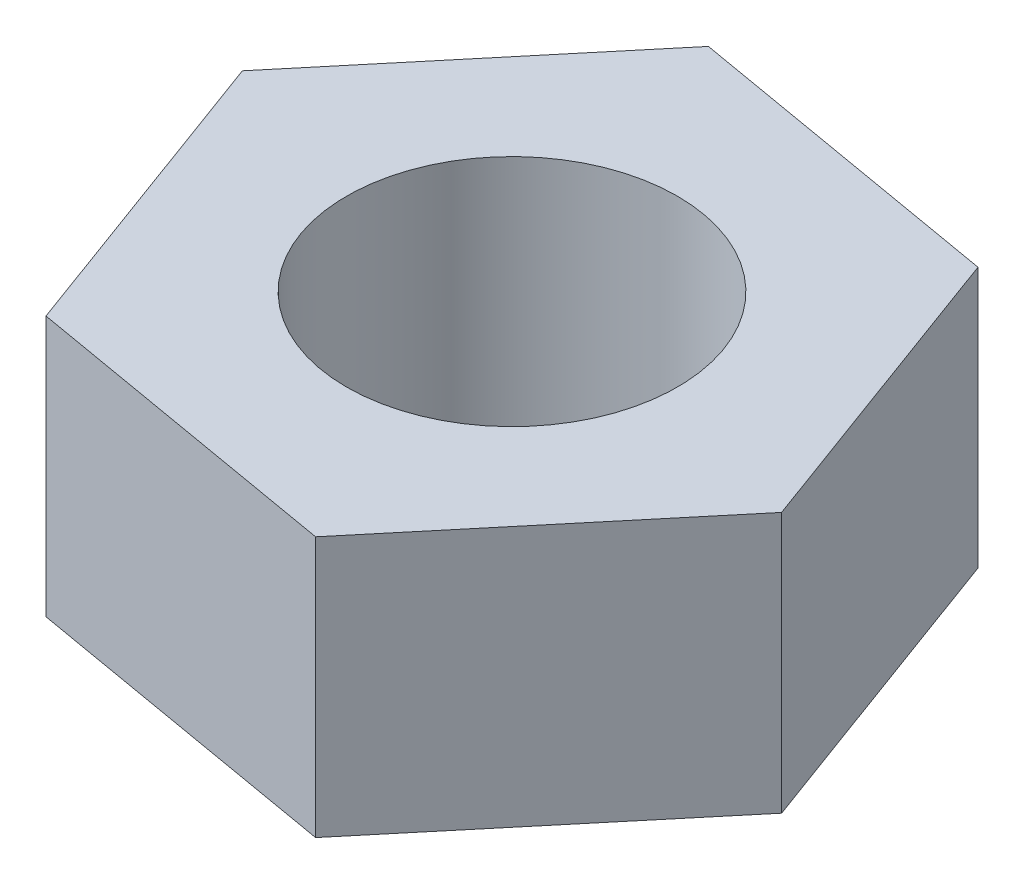
ISO-10303-21;
HEADER;
FILE_DESCRIPTION(('STEP AP214'),'2;1');
FILE_NAME('part.step','',(''),(''),'','','');
FILE_SCHEMA(('AUTOMOTIVE_DESIGN { 1 0 10303 214 1 1 1 1 }'));
ENDSEC;
DATA;
#1=APPLICATION_CONTEXT('core data for automotive mechanical design processes');
#2=APPLICATION_PROTOCOL_DEFINITION('international standard','automotive_design',2000,#1);
#3=PRODUCT_CONTEXT('',#1,'mechanical');
#4=PRODUCT('Part','Part','',(#3));
#5=PRODUCT_RELATED_PRODUCT_CATEGORY('part','',(#4));
#6=PRODUCT_DEFINITION_FORMATION('','',#4);
#7=PRODUCT_DEFINITION_CONTEXT('part definition',#1,'design');
#8=PRODUCT_DEFINITION('design','',#6,#7);
#9=PRODUCT_DEFINITION_SHAPE('','',#8);
#10=(LENGTH_UNIT() NAMED_UNIT(*) SI_UNIT(.MILLI.,.METRE.));
#11=(NAMED_UNIT(*) PLANE_ANGLE_UNIT() SI_UNIT($,.RADIAN.));
#12=(NAMED_UNIT(*) SI_UNIT($,.STERADIAN.) SOLID_ANGLE_UNIT());
#13=UNCERTAINTY_MEASURE_WITH_UNIT(LENGTH_MEASURE(1.E-05),#10,'distance_accuracy_value','');
#14=(GEOMETRIC_REPRESENTATION_CONTEXT(3) GLOBAL_UNCERTAINTY_ASSIGNED_CONTEXT((#13)) GLOBAL_UNIT_ASSIGNED_CONTEXT((#10,
#11,#12)) REPRESENTATION_CONTEXT('',''));
#15=CARTESIAN_POINT('',(0.,0.,0.));
#16=DIRECTION('',(0.,0.,1.));
#17=DIRECTION('',(1.,0.,0.));
#18=AXIS2_PLACEMENT_3D('',#15,#16,#17);
#19=CARTESIAN_POINT('',(0.,5.,0.));
#20=DIRECTION('',(0.,1.,0.));
#21=DIRECTION('',(0.,0.,1.));
#22=AXIS2_PLACEMENT_3D('',#19,#20,#21);
#23=PLANE('',#22);
#24=DIRECTION('',(-0.640341991601785,0.,0.768089925589094));
#25=VECTOR('',#24,1.);
#26=CARTESIAN_POINT('',(-2.1911356740041,5.,-5.96089404296369));
#27=LINE('',#26,#25);
#28=CARTESIAN_POINT('',(-2.1911356740041,5.,-5.96089404296369));
#29=VERTEX_POINT('',#28);
#30=CARTESIAN_POINT('',(-6.25785350747593,5.,-1.08286786465595));
#31=VERTEX_POINT('',#30);
#32=EDGE_CURVE('E129',#29,#31,#27,.T.);
#33=ORIENTED_EDGE('',*,*,#32,.T.);
#34=DIRECTION('',(0.345014392150162,0.,0.938597394631614));
#35=VECTOR('',#34,1.);
#36=CARTESIAN_POINT('',(-6.25785350747593,5.,-1.08286786465595));
#37=LINE('',#36,#35);
#38=CARTESIAN_POINT('',(-4.06671783347183,5.,4.87802617830773));
#39=VERTEX_POINT('',#38);
#40=EDGE_CURVE('E87',#31,#39,#37,.T.);
#41=ORIENTED_EDGE('',*,*,#40,.T.);
#42=DIRECTION('',(0.985356383751947,0.,0.170507469042521));
#43=VECTOR('',#42,1.);
#44=CARTESIAN_POINT('',(-4.06671783347183,5.,4.87802617830773));
#45=LINE('',#44,#43);
#46=CARTESIAN_POINT('',(2.1911356740041,5.,5.96089404296369));
#47=VERTEX_POINT('',#46);
#48=EDGE_CURVE('E100',#39,#47,#45,.T.);
#49=ORIENTED_EDGE('',*,*,#48,.T.);
#50=DIRECTION('',(0.640341991601785,0.,-0.768089925589094));
#51=VECTOR('',#50,1.);
#52=CARTESIAN_POINT('',(2.1911356740041,5.,5.96089404296369));
#53=LINE('',#52,#51);
#54=CARTESIAN_POINT('',(6.25785350747593,5.,1.08286786465595));
#55=VERTEX_POINT('',#54);
#56=EDGE_CURVE('E94',#47,#55,#53,.T.);
#57=ORIENTED_EDGE('',*,*,#56,.T.);
#58=DIRECTION('',(-0.345014392150162,0.,-0.938597394631614));
#59=VECTOR('',#58,1.);
#60=CARTESIAN_POINT('',(6.25785350747593,5.,1.08286786465595));
#61=LINE('',#60,#59);
#62=CARTESIAN_POINT('',(4.06671783347182,5.,-4.87802617830774));
#63=VERTEX_POINT('',#62);
#64=EDGE_CURVE('E98',#55,#63,#61,.T.);
#65=ORIENTED_EDGE('',*,*,#64,.T.);
#66=DIRECTION('',(-0.985356383751947,0.,-0.170507469042521));
#67=VECTOR('',#66,1.);
#68=CARTESIAN_POINT('',(4.06671783347182,5.,-4.87802617830774));
#69=LINE('',#68,#67);
#70=EDGE_CURVE('E50',#63,#29,#69,.T.);
#71=ORIENTED_EDGE('',*,*,#70,.T.);
#72=EDGE_LOOP('',(#33,#41,#49,#57,#65,#71));
#73=FACE_BOUND('',#72,.T.);
#74=CARTESIAN_POINT('',(0.,5.,0.));
#75=DIRECTION('',(0.,1.,0.));
#76=DIRECTION('',(0.,0.,1.));
#77=AXIS2_PLACEMENT_3D('',#74,#75,#76);
#78=CIRCLE('',#77,3.175);
#79=CARTESIAN_POINT('',(0.,5.,3.175));
#80=VERTEX_POINT('',#79);
#81=EDGE_CURVE('E122',#80,#80,#78,.T.);
#82=ORIENTED_EDGE('',*,*,#81,.F.);
#83=EDGE_LOOP('',(#82));
#84=FACE_BOUND('',#83,.T.);
#85=ADVANCED_FACE('F33',(#73,#84),#23,.T.);
#86=CARTESIAN_POINT('',(0.,0.,0.));
#87=DIRECTION('',(0.,1.,0.));
#88=DIRECTION('',(0.,0.,1.));
#89=AXIS2_PLACEMENT_3D('',#86,#87,#88);
#90=PLANE('',#89);
#91=DIRECTION('',(-0.640341991601785,0.,0.768089925589094));
#92=VECTOR('',#91,1.);
#93=CARTESIAN_POINT('',(-2.1911356740041,0.,-5.96089404296369));
#94=LINE('',#93,#92);
#95=CARTESIAN_POINT('',(-2.1911356740041,0.,-5.96089404296369));
#96=VERTEX_POINT('',#95);
#97=CARTESIAN_POINT('',(-6.25785350747593,0.,-1.08286786465595));
#98=VERTEX_POINT('',#97);
#99=EDGE_CURVE('E118',#96,#98,#94,.T.);
#100=ORIENTED_EDGE('',*,*,#99,.F.);
#101=DIRECTION('',(-0.985356383751947,0.,-0.170507469042521));
#102=VECTOR('',#101,1.);
#103=CARTESIAN_POINT('',(4.06671783347182,0.,-4.87802617830774));
#104=LINE('',#103,#102);
#105=CARTESIAN_POINT('',(4.06671783347182,0.,-4.87802617830774));
#106=VERTEX_POINT('',#105);
#107=EDGE_CURVE('E79',#106,#96,#104,.T.);
#108=ORIENTED_EDGE('',*,*,#107,.F.);
#109=DIRECTION('',(-0.345014392150162,0.,-0.938597394631614));
#110=VECTOR('',#109,1.);
#111=CARTESIAN_POINT('',(6.25785350747593,0.,1.08286786465595));
#112=LINE('',#111,#110);
#113=CARTESIAN_POINT('',(6.25785350747593,0.,1.08286786465595));
#114=VERTEX_POINT('',#113);
#115=EDGE_CURVE('E73',#114,#106,#112,.T.);
#116=ORIENTED_EDGE('',*,*,#115,.F.);
#117=DIRECTION('',(0.640341991601785,0.,-0.768089925589094));
#118=VECTOR('',#117,1.);
#119=CARTESIAN_POINT('',(2.1911356740041,0.,5.96089404296369));
#120=LINE('',#119,#118);
#121=CARTESIAN_POINT('',(2.1911356740041,0.,5.96089404296369));
#122=VERTEX_POINT('',#121);
#123=EDGE_CURVE('E108',#122,#114,#120,.T.);
#124=ORIENTED_EDGE('',*,*,#123,.F.);
#125=DIRECTION('',(0.985356383751947,0.,0.170507469042521));
#126=VECTOR('',#125,1.);
#127=CARTESIAN_POINT('',(-4.06671783347183,0.,4.87802617830773));
#128=LINE('',#127,#126);
#129=CARTESIAN_POINT('',(-4.06671783347183,0.,4.87802617830773));
#130=VERTEX_POINT('',#129);
#131=EDGE_CURVE('E124',#130,#122,#128,.T.);
#132=ORIENTED_EDGE('',*,*,#131,.F.);
#133=DIRECTION('',(0.345014392150162,0.,0.938597394631614));
#134=VECTOR('',#133,1.);
#135=CARTESIAN_POINT('',(-6.25785350747593,0.,-1.08286786465595));
#136=LINE('',#135,#134);
#137=EDGE_CURVE('E121',#98,#130,#136,.T.);
#138=ORIENTED_EDGE('',*,*,#137,.F.);
#139=EDGE_LOOP('',(#100,#108,#116,#124,#132,#138));
#140=FACE_BOUND('',#139,.T.);
#141=CARTESIAN_POINT('',(0.,0.,0.));
#142=DIRECTION('',(0.,1.,0.));
#143=DIRECTION('',(0.,0.,1.));
#144=AXIS2_PLACEMENT_3D('',#141,#142,#143);
#145=CIRCLE('',#144,3.175);
#146=CARTESIAN_POINT('',(0.,0.,3.175));
#147=VERTEX_POINT('',#146);
#148=EDGE_CURVE('E222',#147,#147,#145,.T.);
#149=ORIENTED_EDGE('',*,*,#148,.T.);
#150=EDGE_LOOP('',(#149));
#151=FACE_BOUND('',#150,.T.);
#152=ADVANCED_FACE('F138',(#140,#151),#90,.F.);
#153=CARTESIAN_POINT('',(-2.1911356740041,5.,-5.96089404296369));
#154=DIRECTION('',(0.768089925589094,0.,0.640341991601785));
#155=DIRECTION('',(0.640341991601785,0.,-0.768089925589094));
#156=AXIS2_PLACEMENT_3D('',#153,#154,#155);
#157=PLANE('',#156);
#158=ORIENTED_EDGE('',*,*,#99,.T.);
#159=DIRECTION('',(0.,-1.,0.));
#160=VECTOR('',#159,1.);
#161=CARTESIAN_POINT('',(-6.25785350747593,5.,-1.08286786465595));
#162=LINE('',#161,#160);
#163=EDGE_CURVE('E11',#31,#98,#162,.T.);
#164=ORIENTED_EDGE('',*,*,#163,.F.);
#165=ORIENTED_EDGE('',*,*,#32,.F.);
#166=DIRECTION('',(0.,-1.,0.));
#167=VECTOR('',#166,1.);
#168=CARTESIAN_POINT('',(-2.1911356740041,5.,-5.96089404296369));
#169=LINE('',#168,#167);
#170=EDGE_CURVE('E114',#29,#96,#169,.T.);
#171=ORIENTED_EDGE('',*,*,#170,.T.);
#172=EDGE_LOOP('',(#158,#164,#165,#171));
#173=FACE_BOUND('',#172,.T.);
#174=ADVANCED_FACE('F35',(#173),#157,.F.);
#175=CARTESIAN_POINT('',(-6.25785350747593,5.,-1.08286786465595));
#176=DIRECTION('',(0.938597394631614,0.,-0.345014392150162));
#177=DIRECTION('',(-0.345014392150162,0.,-0.938597394631614));
#178=AXIS2_PLACEMENT_3D('',#175,#176,#177);
#179=PLANE('',#178);
#180=ORIENTED_EDGE('',*,*,#137,.T.);
#181=DIRECTION('',(0.,-1.,0.));
#182=VECTOR('',#181,1.);
#183=CARTESIAN_POINT('',(-4.06671783347183,5.,4.87802617830773));
#184=LINE('',#183,#182);
#185=EDGE_CURVE('E42',#39,#130,#184,.T.);
#186=ORIENTED_EDGE('',*,*,#185,.F.);
#187=ORIENTED_EDGE('',*,*,#40,.F.);
#188=ORIENTED_EDGE('',*,*,#163,.T.);
#189=EDGE_LOOP('',(#180,#186,#187,#188));
#190=FACE_BOUND('',#189,.T.);
#191=ADVANCED_FACE('F163',(#190),#179,.F.);
#192=CARTESIAN_POINT('',(-4.06671783347183,5.,4.87802617830773));
#193=DIRECTION('',(0.170507469042521,0.,-0.985356383751947));
#194=DIRECTION('',(-0.985356383751947,0.,-0.170507469042521));
#195=AXIS2_PLACEMENT_3D('',#192,#193,#194);
#196=PLANE('',#195);
#197=ORIENTED_EDGE('',*,*,#131,.T.);
#198=DIRECTION('',(0.,-1.,0.));
#199=VECTOR('',#198,1.);
#200=CARTESIAN_POINT('',(2.1911356740041,5.,5.96089404296369));
#201=LINE('',#200,#199);
#202=EDGE_CURVE('E109',#47,#122,#201,.T.);
#203=ORIENTED_EDGE('',*,*,#202,.F.);
#204=ORIENTED_EDGE('',*,*,#48,.F.);
#205=ORIENTED_EDGE('',*,*,#185,.T.);
#206=EDGE_LOOP('',(#197,#203,#204,#205));
#207=FACE_BOUND('',#206,.T.);
#208=ADVANCED_FACE('F135',(#207),#196,.F.);
#209=CARTESIAN_POINT('',(2.1911356740041,5.,5.96089404296369));
#210=DIRECTION('',(-0.768089925589094,0.,-0.640341991601785));
#211=DIRECTION('',(-0.640341991601785,0.,0.768089925589094));
#212=AXIS2_PLACEMENT_3D('',#209,#210,#211);
#213=PLANE('',#212);
#214=ORIENTED_EDGE('',*,*,#123,.T.);
#215=DIRECTION('',(0.,-1.,0.));
#216=VECTOR('',#215,1.);
#217=CARTESIAN_POINT('',(6.25785350747593,5.,1.08286786465595));
#218=LINE('',#217,#216);
#219=EDGE_CURVE('E105',#55,#114,#218,.T.);
#220=ORIENTED_EDGE('',*,*,#219,.F.);
#221=ORIENTED_EDGE('',*,*,#56,.F.);
#222=ORIENTED_EDGE('',*,*,#202,.T.);
#223=EDGE_LOOP('',(#214,#220,#221,#222));
#224=FACE_BOUND('',#223,.T.);
#225=ADVANCED_FACE('F106',(#224),#213,.F.);
#226=CARTESIAN_POINT('',(6.25785350747593,5.,1.08286786465595));
#227=DIRECTION('',(-0.938597394631614,0.,0.345014392150162));
#228=DIRECTION('',(0.345014392150162,0.,0.938597394631614));
#229=AXIS2_PLACEMENT_3D('',#226,#227,#228);
#230=PLANE('',#229);
#231=ORIENTED_EDGE('',*,*,#115,.T.);
#232=DIRECTION('',(0.,-1.,0.));
#233=VECTOR('',#232,1.);
#234=CARTESIAN_POINT('',(4.06671783347182,5.,-4.87802617830774));
#235=LINE('',#234,#233);
#236=EDGE_CURVE('E110',#63,#106,#235,.T.);
#237=ORIENTED_EDGE('',*,*,#236,.F.);
#238=ORIENTED_EDGE('',*,*,#64,.F.);
#239=ORIENTED_EDGE('',*,*,#219,.T.);
#240=EDGE_LOOP('',(#231,#237,#238,#239));
#241=FACE_BOUND('',#240,.T.);
#242=ADVANCED_FACE('F112',(#241),#230,.F.);
#243=CARTESIAN_POINT('',(4.06671783347182,5.,-4.87802617830774));
#244=DIRECTION('',(-0.170507469042521,0.,0.985356383751947));
#245=DIRECTION('',(0.985356383751947,0.,0.170507469042521));
#246=AXIS2_PLACEMENT_3D('',#243,#244,#245);
#247=PLANE('',#246);
#248=ORIENTED_EDGE('',*,*,#107,.T.);
#249=ORIENTED_EDGE('',*,*,#170,.F.);
#250=ORIENTED_EDGE('',*,*,#70,.F.);
#251=ORIENTED_EDGE('',*,*,#236,.T.);
#252=EDGE_LOOP('',(#248,#249,#250,#251));
#253=FACE_BOUND('',#252,.T.);
#254=ADVANCED_FACE('F143',(#253),#247,.F.);
#255=CARTESIAN_POINT('',(0.,5.,0.));
#256=DIRECTION('',(0.,-1.,0.));
#257=DIRECTION('',(0.,0.,-1.));
#258=AXIS2_PLACEMENT_3D('',#255,#256,#257);
#259=CYLINDRICAL_SURFACE('',#258,3.175);
#260=ORIENTED_EDGE('',*,*,#81,.T.);
#261=EDGE_LOOP('',(#260));
#262=FACE_BOUND('',#261,.T.);
#263=ORIENTED_EDGE('',*,*,#148,.F.);
#264=EDGE_LOOP('',(#263));
#265=FACE_BOUND('',#264,.T.);
#266=ADVANCED_FACE('F145',(#262,#265),#259,.F.);
#267=CLOSED_SHELL('',(#85,#152,#174,#191,#208,#225,#242,#254,#266));
#268=MANIFOLD_SOLID_BREP('B2',#267);
#269=ADVANCED_BREP_SHAPE_REPRESENTATION('',(#18,#268),#14);
#270=SHAPE_DEFINITION_REPRESENTATION(#9,#269);
ENDSEC;
END-ISO-10303-21;
